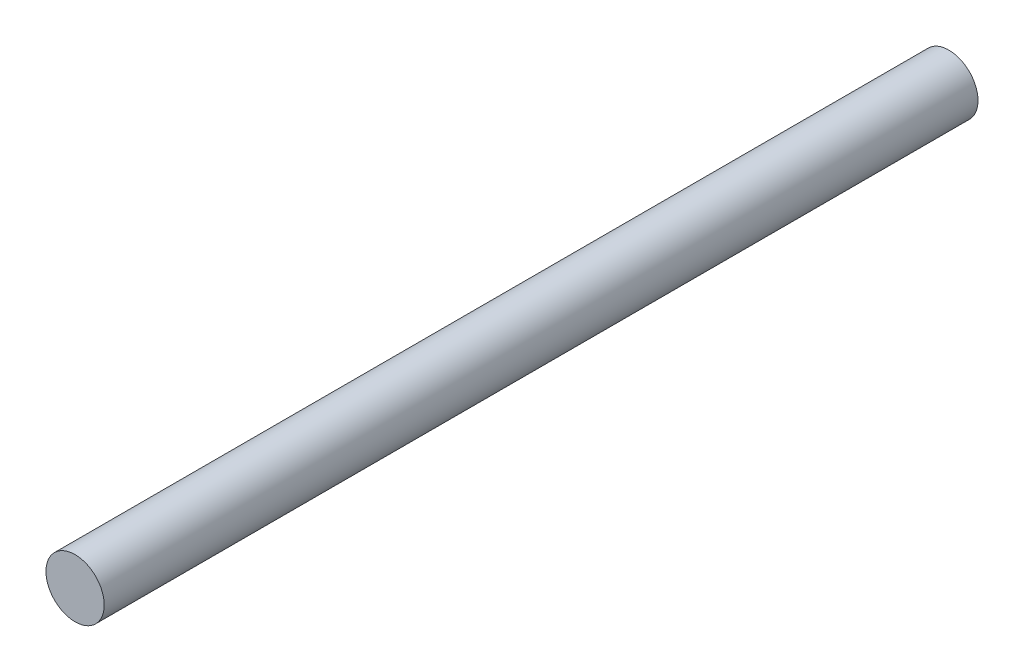
ISO-10303-21;
HEADER;
FILE_DESCRIPTION(('STEP AP214'),'2;1');
FILE_NAME('part.step','',(''),(''),'','','');
FILE_SCHEMA(('AUTOMOTIVE_DESIGN { 1 0 10303 214 1 1 1 1 }'));
ENDSEC;
DATA;
#1=APPLICATION_CONTEXT('core data for automotive mechanical design processes');
#2=APPLICATION_PROTOCOL_DEFINITION('international standard','automotive_design',2000,#1);
#3=PRODUCT_CONTEXT('',#1,'mechanical');
#4=PRODUCT('Part','Part','',(#3));
#5=PRODUCT_RELATED_PRODUCT_CATEGORY('part','',(#4));
#6=PRODUCT_DEFINITION_FORMATION('','',#4);
#7=PRODUCT_DEFINITION_CONTEXT('part definition',#1,'design');
#8=PRODUCT_DEFINITION('design','',#6,#7);
#9=PRODUCT_DEFINITION_SHAPE('','',#8);
#10=(LENGTH_UNIT() NAMED_UNIT(*) SI_UNIT(.MILLI.,.METRE.));
#11=(NAMED_UNIT(*) PLANE_ANGLE_UNIT() SI_UNIT($,.RADIAN.));
#12=(NAMED_UNIT(*) SI_UNIT($,.STERADIAN.) SOLID_ANGLE_UNIT());
#13=UNCERTAINTY_MEASURE_WITH_UNIT(LENGTH_MEASURE(1.E-05),#10,'distance_accuracy_value','');
#14=(GEOMETRIC_REPRESENTATION_CONTEXT(3) GLOBAL_UNCERTAINTY_ASSIGNED_CONTEXT((#13)) GLOBAL_UNIT_ASSIGNED_CONTEXT((#10,
#11,#12)) REPRESENTATION_CONTEXT('',''));
#15=CARTESIAN_POINT('',(0.,0.,0.));
#16=DIRECTION('',(0.,0.,1.));
#17=DIRECTION('',(1.,0.,0.));
#18=AXIS2_PLACEMENT_3D('',#15,#16,#17);
#19=CARTESIAN_POINT('',(0.,0.,15.));
#20=DIRECTION('',(0.,0.,-1.));
#21=DIRECTION('',(-1.,0.,0.));
#22=AXIS2_PLACEMENT_3D('',#19,#20,#21);
#23=CYLINDRICAL_SURFACE('',#22,0.5);
#24=CARTESIAN_POINT('',(0.,0.,15.));
#25=DIRECTION('',(0.,0.,1.));
#26=DIRECTION('',(1.,0.,0.));
#27=AXIS2_PLACEMENT_3D('',#24,#25,#26);
#28=CIRCLE('',#27,0.5);
#29=CARTESIAN_POINT('',(0.5,0.,15.));
#30=VERTEX_POINT('',#29);
#31=EDGE_CURVE('E10',#30,#30,#28,.T.);
#32=ORIENTED_EDGE('',*,*,#31,.F.);
#33=EDGE_LOOP('',(#32));
#34=FACE_BOUND('',#33,.T.);
#35=CARTESIAN_POINT('',(0.,0.,0.));
#36=DIRECTION('',(0.,0.,1.));
#37=DIRECTION('',(1.,0.,0.));
#38=AXIS2_PLACEMENT_3D('',#35,#36,#37);
#39=CIRCLE('',#38,0.5);
#40=CARTESIAN_POINT('',(0.5,0.,0.));
#41=VERTEX_POINT('',#40);
#42=EDGE_CURVE('E40',#41,#41,#39,.T.);
#43=ORIENTED_EDGE('',*,*,#42,.T.);
#44=EDGE_LOOP('',(#43));
#45=FACE_BOUND('',#44,.T.);
#46=ADVANCED_FACE('F37',(#34,#45),#23,.T.);
#47=CARTESIAN_POINT('',(0.,0.,15.));
#48=DIRECTION('',(0.,0.,1.));
#49=DIRECTION('',(1.,0.,0.));
#50=AXIS2_PLACEMENT_3D('',#47,#48,#49);
#51=PLANE('',#50);
#52=ORIENTED_EDGE('',*,*,#31,.T.);
#53=EDGE_LOOP('',(#52));
#54=FACE_BOUND('',#53,.T.);
#55=ADVANCED_FACE('F52',(#54),#51,.T.);
#56=CARTESIAN_POINT('',(0.,0.,0.));
#57=DIRECTION('',(0.,0.,1.));
#58=DIRECTION('',(1.,0.,0.));
#59=AXIS2_PLACEMENT_3D('',#56,#57,#58);
#60=PLANE('',#59);
#61=ORIENTED_EDGE('',*,*,#42,.F.);
#62=EDGE_LOOP('',(#61));
#63=FACE_BOUND('',#62,.T.);
#64=ADVANCED_FACE('F50',(#63),#60,.F.);
#65=CLOSED_SHELL('',(#46,#55,#64));
#66=MANIFOLD_SOLID_BREP('B2',#65);
#67=ADVANCED_BREP_SHAPE_REPRESENTATION('',(#18,#66),#14);
#68=SHAPE_DEFINITION_REPRESENTATION(#9,#67);
ENDSEC;
END-ISO-10303-21;
